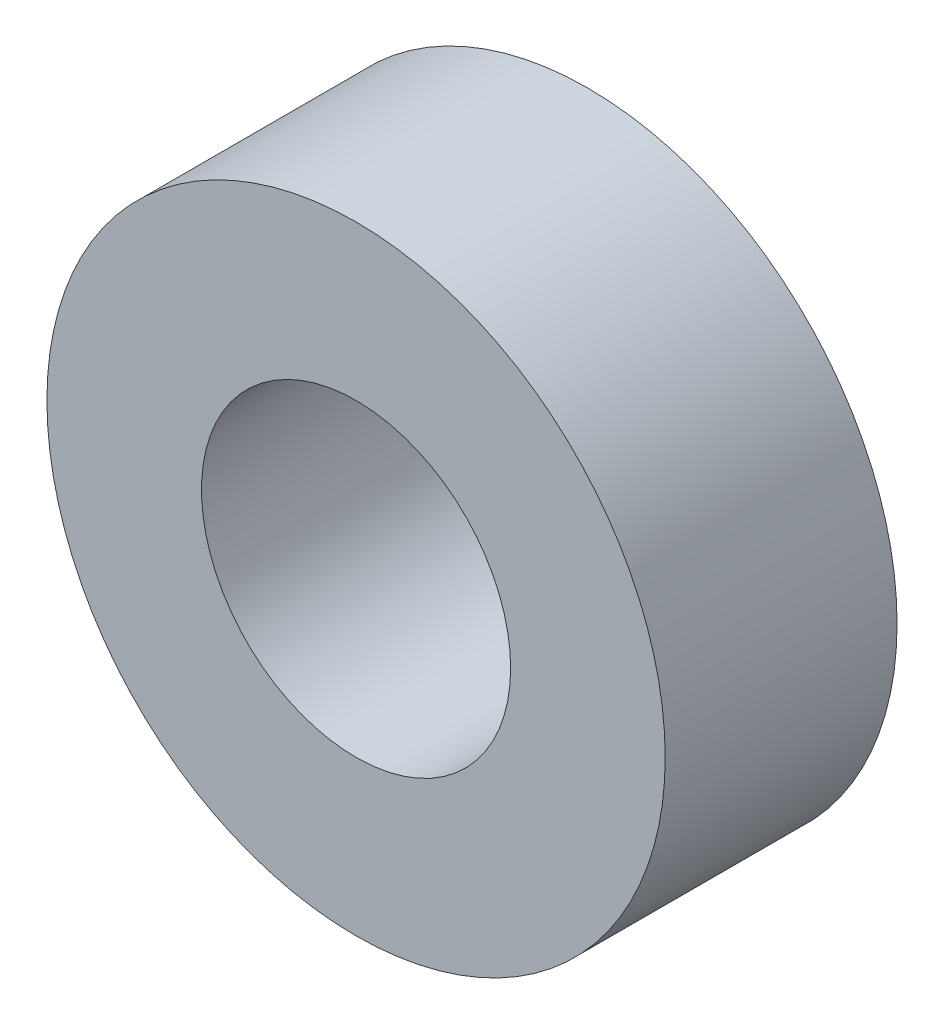
ISO-10303-21;
HEADER;
FILE_DESCRIPTION(('STEP AP214'),'2;1');
FILE_NAME('part.step','',(''),(''),'','','');
FILE_SCHEMA(('AUTOMOTIVE_DESIGN { 1 0 10303 214 1 1 1 1 }'));
ENDSEC;
DATA;
#1=APPLICATION_CONTEXT('core data for automotive mechanical design processes');
#2=APPLICATION_PROTOCOL_DEFINITION('international standard','automotive_design',2000,#1);
#3=PRODUCT_CONTEXT('',#1,'mechanical');
#4=PRODUCT('Part','Part','',(#3));
#5=PRODUCT_RELATED_PRODUCT_CATEGORY('part','',(#4));
#6=PRODUCT_DEFINITION_FORMATION('','',#4);
#7=PRODUCT_DEFINITION_CONTEXT('part definition',#1,'design');
#8=PRODUCT_DEFINITION('design','',#6,#7);
#9=PRODUCT_DEFINITION_SHAPE('','',#8);
#10=(LENGTH_UNIT() NAMED_UNIT(*) SI_UNIT(.MILLI.,.METRE.));
#11=(NAMED_UNIT(*) PLANE_ANGLE_UNIT() SI_UNIT($,.RADIAN.));
#12=(NAMED_UNIT(*) SI_UNIT($,.STERADIAN.) SOLID_ANGLE_UNIT());
#13=UNCERTAINTY_MEASURE_WITH_UNIT(LENGTH_MEASURE(1.E-05),#10,'distance_accuracy_value','');
#14=(GEOMETRIC_REPRESENTATION_CONTEXT(3) GLOBAL_UNCERTAINTY_ASSIGNED_CONTEXT((#13)) GLOBAL_UNIT_ASSIGNED_CONTEXT((#10,
#11,#12)) REPRESENTATION_CONTEXT('',''));
#15=CARTESIAN_POINT('',(0.,0.,0.));
#16=DIRECTION('',(0.,0.,1.));
#17=DIRECTION('',(1.,0.,0.));
#18=AXIS2_PLACEMENT_3D('',#15,#16,#17);
#19=CARTESIAN_POINT('',(0.,0.,3.));
#20=DIRECTION('',(0.,0.,1.));
#21=DIRECTION('',(1.,0.,0.));
#22=AXIS2_PLACEMENT_3D('',#19,#20,#21);
#23=PLANE('',#22);
#24=CARTESIAN_POINT('',(0.,0.,3.));
#25=DIRECTION('',(0.,0.,1.));
#26=DIRECTION('',(1.,0.,0.));
#27=AXIS2_PLACEMENT_3D('',#24,#25,#26);
#28=CIRCLE('',#27,4.);
#29=CARTESIAN_POINT('',(4.,0.,3.));
#30=VERTEX_POINT('',#29);
#31=EDGE_CURVE('E10',#30,#30,#28,.T.);
#32=ORIENTED_EDGE('',*,*,#31,.T.);
#33=EDGE_LOOP('',(#32));
#34=FACE_BOUND('',#33,.T.);
#35=CARTESIAN_POINT('',(0.,0.,3.));
#36=DIRECTION('',(0.,0.,1.));
#37=DIRECTION('',(1.,0.,0.));
#38=AXIS2_PLACEMENT_3D('',#35,#36,#37);
#39=CIRCLE('',#38,2.);
#40=CARTESIAN_POINT('',(2.,0.,3.));
#41=VERTEX_POINT('',#40);
#42=EDGE_CURVE('E43',#41,#41,#39,.T.);
#43=ORIENTED_EDGE('',*,*,#42,.F.);
#44=EDGE_LOOP('',(#43));
#45=FACE_BOUND('',#44,.T.);
#46=ADVANCED_FACE('F32',(#34,#45),#23,.T.);
#47=CARTESIAN_POINT('',(0.,0.,0.));
#48=DIRECTION('',(0.,0.,1.));
#49=DIRECTION('',(1.,0.,0.));
#50=AXIS2_PLACEMENT_3D('',#47,#48,#49);
#51=PLANE('',#50);
#52=CARTESIAN_POINT('',(0.,0.,0.));
#53=DIRECTION('',(0.,0.,1.));
#54=DIRECTION('',(1.,0.,0.));
#55=AXIS2_PLACEMENT_3D('',#52,#53,#54);
#56=CIRCLE('',#55,4.);
#57=CARTESIAN_POINT('',(4.,0.,0.));
#58=VERTEX_POINT('',#57);
#59=EDGE_CURVE('E36',#58,#58,#56,.T.);
#60=ORIENTED_EDGE('',*,*,#59,.F.);
#61=EDGE_LOOP('',(#60));
#62=FACE_BOUND('',#61,.T.);
#63=CARTESIAN_POINT('',(0.,0.,0.));
#64=DIRECTION('',(0.,0.,1.));
#65=DIRECTION('',(1.,0.,0.));
#66=AXIS2_PLACEMENT_3D('',#63,#64,#65);
#67=CIRCLE('',#66,2.);
#68=CARTESIAN_POINT('',(2.,0.,0.));
#69=VERTEX_POINT('',#68);
#70=EDGE_CURVE('E45',#69,#69,#67,.T.);
#71=ORIENTED_EDGE('',*,*,#70,.T.);
#72=EDGE_LOOP('',(#71));
#73=FACE_BOUND('',#72,.T.);
#74=ADVANCED_FACE('F55',(#62,#73),#51,.F.);
#75=CARTESIAN_POINT('',(0.,0.,3.));
#76=DIRECTION('',(0.,0.,-1.));
#77=DIRECTION('',(-1.,0.,0.));
#78=AXIS2_PLACEMENT_3D('',#75,#76,#77);
#79=CYLINDRICAL_SURFACE('',#78,4.);
#80=ORIENTED_EDGE('',*,*,#31,.F.);
#81=EDGE_LOOP('',(#80));
#82=FACE_BOUND('',#81,.T.);
#83=ORIENTED_EDGE('',*,*,#59,.T.);
#84=EDGE_LOOP('',(#83));
#85=FACE_BOUND('',#84,.T.);
#86=ADVANCED_FACE('F34',(#82,#85),#79,.T.);
#87=CARTESIAN_POINT('',(0.,0.,3.));
#88=DIRECTION('',(0.,0.,-1.));
#89=DIRECTION('',(-1.,0.,0.));
#90=AXIS2_PLACEMENT_3D('',#87,#88,#89);
#91=CYLINDRICAL_SURFACE('',#90,2.);
#92=ORIENTED_EDGE('',*,*,#42,.T.);
#93=EDGE_LOOP('',(#92));
#94=FACE_BOUND('',#93,.T.);
#95=ORIENTED_EDGE('',*,*,#70,.F.);
#96=EDGE_LOOP('',(#95));
#97=FACE_BOUND('',#96,.T.);
#98=ADVANCED_FACE('F51',(#94,#97),#91,.F.);
#99=CLOSED_SHELL('',(#46,#74,#86,#98));
#100=MANIFOLD_SOLID_BREP('B2',#99);
#101=ADVANCED_BREP_SHAPE_REPRESENTATION('',(#18,#100),#14);
#102=SHAPE_DEFINITION_REPRESENTATION(#9,#101);
ENDSEC;
END-ISO-10303-21;
